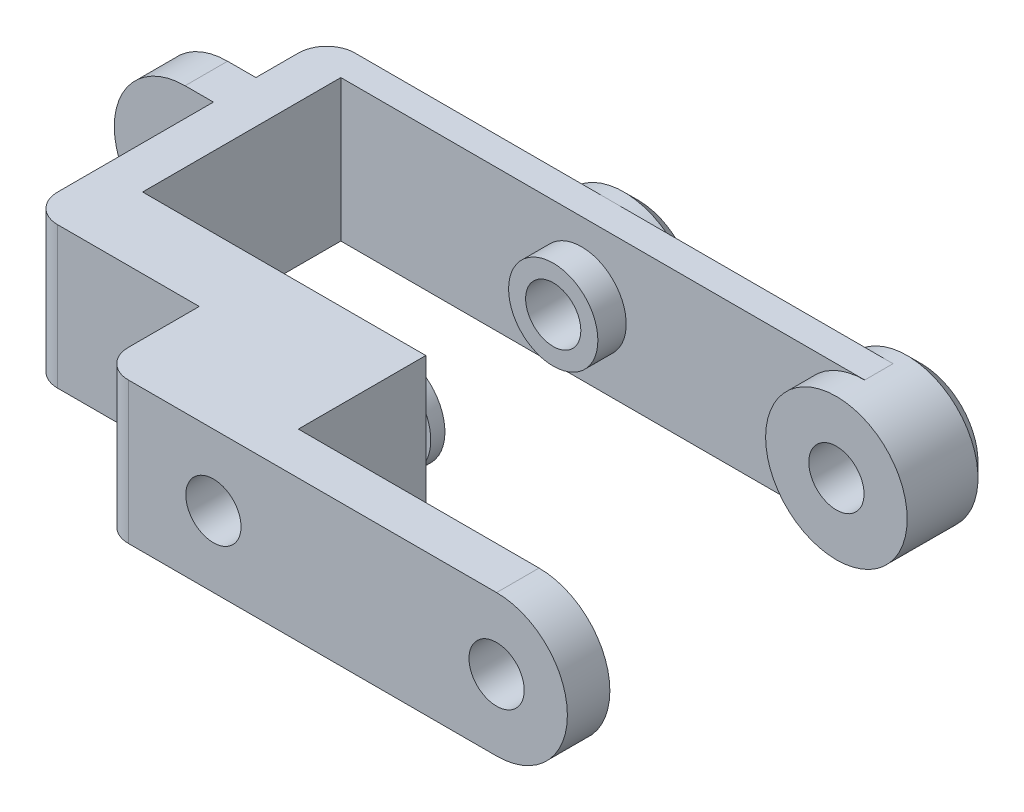
ISO-10303-21;
HEADER;
FILE_DESCRIPTION(('STEP AP214'),'2;1');
FILE_NAME('part.step','',(''),(''),'','','');
FILE_SCHEMA(('AUTOMOTIVE_DESIGN { 1 0 10303 214 1 1 1 1 }'));
ENDSEC;
DATA;
#1=APPLICATION_CONTEXT('core data for automotive mechanical design processes');
#2=APPLICATION_PROTOCOL_DEFINITION('international standard','automotive_design',2000,#1);
#3=PRODUCT_CONTEXT('',#1,'mechanical');
#4=PRODUCT('Part','Part','',(#3));
#5=PRODUCT_RELATED_PRODUCT_CATEGORY('part','',(#4));
#6=PRODUCT_DEFINITION_FORMATION('','',#4);
#7=PRODUCT_DEFINITION_CONTEXT('part definition',#1,'design');
#8=PRODUCT_DEFINITION('design','',#6,#7);
#9=PRODUCT_DEFINITION_SHAPE('','',#8);
#10=(LENGTH_UNIT() NAMED_UNIT(*) SI_UNIT(.MILLI.,.METRE.));
#11=(NAMED_UNIT(*) PLANE_ANGLE_UNIT() SI_UNIT($,.RADIAN.));
#12=(NAMED_UNIT(*) SI_UNIT($,.STERADIAN.) SOLID_ANGLE_UNIT());
#13=UNCERTAINTY_MEASURE_WITH_UNIT(LENGTH_MEASURE(1.E-05),#10,'distance_accuracy_value','');
#14=(GEOMETRIC_REPRESENTATION_CONTEXT(3) GLOBAL_UNCERTAINTY_ASSIGNED_CONTEXT((#13)) GLOBAL_UNIT_ASSIGNED_CONTEXT((#10,
#11,#12)) REPRESENTATION_CONTEXT('',''));
#15=CARTESIAN_POINT('',(0.,0.,0.));
#16=DIRECTION('',(0.,0.,1.));
#17=DIRECTION('',(1.,0.,0.));
#18=AXIS2_PLACEMENT_3D('',#15,#16,#17);
#19=CARTESIAN_POINT('',(-22.,0.,-14.));
#20=DIRECTION('',(0.,0.,1.));
#21=DIRECTION('',(1.,0.,0.));
#22=AXIS2_PLACEMENT_3D('',#19,#20,#21);
#23=PLANE('',#22);
#24=CARTESIAN_POINT('',(0.,0.,-14.));
#25=DIRECTION('',(0.,0.,-1.));
#26=DIRECTION('',(-1.,0.,0.));
#27=AXIS2_PLACEMENT_3D('',#24,#25,#26);
#28=CIRCLE('',#27,5.);
#29=CARTESIAN_POINT('',(0.,-5.,-14.));
#30=VERTEX_POINT('',#29);
#31=CARTESIAN_POINT('',(0.,5.,-14.));
#32=VERTEX_POINT('',#31);
#33=EDGE_CURVE('E206',#30,#32,#28,.T.);
#34=ORIENTED_EDGE('',*,*,#33,.F.);
#35=DIRECTION('',(1.,0.,0.));
#36=VECTOR('',#35,1.);
#37=CARTESIAN_POINT('',(-22.,-5.,-14.));
#38=LINE('',#37,#36);
#39=CARTESIAN_POINT('',(-18.,-5.,-14.));
#40=VERTEX_POINT('',#39);
#41=EDGE_CURVE('E187',#40,#30,#38,.T.);
#42=ORIENTED_EDGE('',*,*,#41,.F.);
#43=DIRECTION('',(0.,1.,0.));
#44=VECTOR('',#43,1.);
#45=CARTESIAN_POINT('',(-18.,0.,-14.));
#46=LINE('',#45,#44);
#47=CARTESIAN_POINT('',(-18.,5.,-14.));
#48=VERTEX_POINT('',#47);
#49=EDGE_CURVE('E390',#40,#48,#46,.T.);
#50=ORIENTED_EDGE('',*,*,#49,.T.);
#51=DIRECTION('',(-1.,0.,0.));
#52=VECTOR('',#51,1.);
#53=CARTESIAN_POINT('',(-22.,5.,-14.));
#54=LINE('',#53,#52);
#55=EDGE_CURVE('E199',#32,#48,#54,.T.);
#56=ORIENTED_EDGE('',*,*,#55,.F.);
#57=EDGE_LOOP('',(#34,#42,#50,#56));
#58=FACE_BOUND('',#57,.T.);
#59=ADVANCED_FACE('F41',(#58),#23,.F.);
#60=EDGE_CURVE('E57',#32,#30,#28,.T.);
#61=ORIENTED_EDGE('',*,*,#60,.F.);
#62=CARTESIAN_POINT('',(20.,5.,-14.));
#63=VERTEX_POINT('',#62);
#64=EDGE_CURVE('E327',#63,#32,#54,.T.);
#65=ORIENTED_EDGE('',*,*,#64,.F.);
#66=CARTESIAN_POINT('',(20.,0.,-14.));
#67=DIRECTION('',(0.,0.,-1.));
#68=DIRECTION('',(-1.,0.,0.));
#69=AXIS2_PLACEMENT_3D('',#66,#67,#68);
#70=CIRCLE('',#69,5.);
#71=CARTESIAN_POINT('',(20.,-5.,-14.));
#72=VERTEX_POINT('',#71);
#73=EDGE_CURVE('E202',#72,#63,#70,.T.);
#74=ORIENTED_EDGE('',*,*,#73,.F.);
#75=EDGE_CURVE('E190',#30,#72,#38,.T.);
#76=ORIENTED_EDGE('',*,*,#75,.F.);
#77=EDGE_LOOP('',(#61,#65,#74,#76));
#78=FACE_BOUND('',#77,.T.);
#79=ADVANCED_FACE('F201',(#78),#23,.F.);
#80=CARTESIAN_POINT('',(-17.,-5.,2.00000000000001));
#81=DIRECTION('',(0.,0.,1.));
#82=DIRECTION('',(1.,0.,0.));
#83=AXIS2_PLACEMENT_3D('',#80,#81,#82);
#84=PLANE('',#83);
#85=CARTESIAN_POINT('',(0.,0.,2.00000000000001));
#86=DIRECTION('',(0.,0.,1.));
#87=DIRECTION('',(1.,0.,0.));
#88=AXIS2_PLACEMENT_3D('',#85,#86,#87);
#89=CIRCLE('',#88,3.35);
#90=CARTESIAN_POINT('',(3.,-1.49080515158756,2.00000000000001));
#91=VERTEX_POINT('',#90);
#92=CARTESIAN_POINT('',(3.,1.49080515158756,2.00000000000001));
#93=VERTEX_POINT('',#92);
#94=EDGE_CURVE('E65',#91,#93,#89,.F.);
#95=ORIENTED_EDGE('',*,*,#94,.F.);
#96=DIRECTION('',(0.,1.,0.));
#97=VECTOR('',#96,1.);
#98=CARTESIAN_POINT('',(3.,-5.,2.00000000000001));
#99=LINE('',#98,#97);
#100=CARTESIAN_POINT('',(3.,-5.,2.00000000000001));
#101=VERTEX_POINT('',#100);
#102=EDGE_CURVE('E287',#101,#91,#99,.T.);
#103=ORIENTED_EDGE('',*,*,#102,.F.);
#104=DIRECTION('',(1.,0.,0.));
#105=VECTOR('',#104,1.);
#106=CARTESIAN_POINT('',(-17.,-5.,2.00000000000001));
#107=LINE('',#106,#105);
#108=CARTESIAN_POINT('',(-17.,-5.,2.00000000000001));
#109=VERTEX_POINT('',#108);
#110=EDGE_CURVE('E273',#109,#101,#107,.T.);
#111=ORIENTED_EDGE('',*,*,#110,.F.);
#112=DIRECTION('',(0.,1.,0.));
#113=VECTOR('',#112,1.);
#114=CARTESIAN_POINT('',(-17.,-5.,2.00000000000001));
#115=LINE('',#114,#113);
#116=CARTESIAN_POINT('',(-17.,5.,2.00000000000001));
#117=VERTEX_POINT('',#116);
#118=EDGE_CURVE('E291',#109,#117,#115,.T.);
#119=ORIENTED_EDGE('',*,*,#118,.T.);
#120=DIRECTION('',(-1.,0.,0.));
#121=VECTOR('',#120,1.);
#122=CARTESIAN_POINT('',(-22.,5.,2.00000000000001));
#123=LINE('',#122,#121);
#124=CARTESIAN_POINT('',(3.,5.,2.00000000000001));
#125=VERTEX_POINT('',#124);
#126=EDGE_CURVE('E316',#125,#117,#123,.T.);
#127=ORIENTED_EDGE('',*,*,#126,.F.);
#128=EDGE_CURVE('E290',#93,#125,#99,.T.);
#129=ORIENTED_EDGE('',*,*,#128,.F.);
#130=EDGE_LOOP('',(#95,#103,#111,#119,#127,#129));
#131=FACE_BOUND('',#130,.T.);
#132=ADVANCED_FACE('F422',(#131),#84,.F.);
#133=CARTESIAN_POINT('',(25.,-5.,-12.));
#134=DIRECTION('',(0.,0.,-1.));
#135=DIRECTION('',(-1.,0.,0.));
#136=AXIS2_PLACEMENT_3D('',#133,#134,#135);
#137=PLANE('',#136);
#138=CARTESIAN_POINT('',(20.,0.,-12.));
#139=DIRECTION('',(0.,0.,1.));
#140=DIRECTION('',(1.,0.,0.));
#141=AXIS2_PLACEMENT_3D('',#138,#139,#140);
#142=CIRCLE('',#141,5.);
#143=CARTESIAN_POINT('',(20.,5.,-12.));
#144=VERTEX_POINT('',#143);
#145=CARTESIAN_POINT('',(20.,-5.,-12.));
#146=VERTEX_POINT('',#145);
#147=EDGE_CURVE('E237',#144,#146,#142,.T.);
#148=ORIENTED_EDGE('',*,*,#147,.F.);
#149=DIRECTION('',(1.,0.,0.));
#150=VECTOR('',#149,1.);
#151=CARTESIAN_POINT('',(-22.,5.,-12.));
#152=LINE('',#151,#150);
#153=CARTESIAN_POINT('',(-17.,5.,-12.));
#154=VERTEX_POINT('',#153);
#155=EDGE_CURVE('E307',#154,#144,#152,.T.);
#156=ORIENTED_EDGE('',*,*,#155,.F.);
#157=DIRECTION('',(0.,1.,0.));
#158=VECTOR('',#157,1.);
#159=CARTESIAN_POINT('',(-17.,-5.,-12.));
#160=LINE('',#159,#158);
#161=CARTESIAN_POINT('',(-17.,-5.,-12.));
#162=VERTEX_POINT('',#161);
#163=EDGE_CURVE('E282',#162,#154,#160,.T.);
#164=ORIENTED_EDGE('',*,*,#163,.F.);
#165=DIRECTION('',(-1.,0.,0.));
#166=VECTOR('',#165,1.);
#167=CARTESIAN_POINT('',(25.,-5.,-12.));
#168=LINE('',#167,#166);
#169=EDGE_CURVE('E253',#146,#162,#168,.T.);
#170=ORIENTED_EDGE('',*,*,#169,.F.);
#171=EDGE_LOOP('',(#148,#156,#164,#170));
#172=FACE_BOUND('',#171,.T.);
#173=CARTESIAN_POINT('',(0.,0.,-12.));
#174=DIRECTION('',(0.,0.,-1.));
#175=DIRECTION('',(-1.,0.,0.));
#176=AXIS2_PLACEMENT_3D('',#173,#174,#175);
#177=CIRCLE('',#176,3.15295516941264);
#178=CARTESIAN_POINT('',(-3.15295516941264,0.,-12.));
#179=VERTEX_POINT('',#178);
#180=EDGE_CURVE('E394',#179,#179,#177,.F.);
#181=ORIENTED_EDGE('',*,*,#180,.F.);
#182=EDGE_LOOP('',(#181));
#183=FACE_BOUND('',#182,.T.);
#184=ADVANCED_FACE('F526',(#172,#183),#137,.F.);
#185=CARTESIAN_POINT('',(20.,0.,14.));
#186=DIRECTION('',(0.,0.,-1.));
#187=DIRECTION('',(-1.,0.,0.));
#188=AXIS2_PLACEMENT_3D('',#185,#186,#187);
#189=CYLINDRICAL_SURFACE('',#188,5.);
#190=CARTESIAN_POINT('',(20.,0.,11.));
#191=DIRECTION('',(0.,0.,1.));
#192=DIRECTION('',(1.,0.,0.));
#193=AXIS2_PLACEMENT_3D('',#190,#191,#192);
#194=CIRCLE('',#193,5.);
#195=CARTESIAN_POINT('',(20.,-5.,11.));
#196=VERTEX_POINT('',#195);
#197=CARTESIAN_POINT('',(20.,5.,11.));
#198=VERTEX_POINT('',#197);
#199=EDGE_CURVE('E314',#196,#198,#194,.T.);
#200=ORIENTED_EDGE('',*,*,#199,.T.);
#201=DIRECTION('',(0.,0.,-1.));
#202=VECTOR('',#201,1.);
#203=CARTESIAN_POINT('',(20.,5.,14.));
#204=LINE('',#203,#202);
#205=CARTESIAN_POINT('',(20.,5.,14.));
#206=VERTEX_POINT('',#205);
#207=EDGE_CURVE('E337',#206,#198,#204,.T.);
#208=ORIENTED_EDGE('',*,*,#207,.F.);
#209=CARTESIAN_POINT('',(20.,0.,14.));
#210=DIRECTION('',(0.,0.,1.));
#211=DIRECTION('',(1.,0.,0.));
#212=AXIS2_PLACEMENT_3D('',#209,#210,#211);
#213=CIRCLE('',#212,5.);
#214=CARTESIAN_POINT('',(20.,-5.,14.));
#215=VERTEX_POINT('',#214);
#216=EDGE_CURVE('E326',#215,#206,#213,.T.);
#217=ORIENTED_EDGE('',*,*,#216,.F.);
#218=DIRECTION('',(0.,0.,-1.));
#219=VECTOR('',#218,1.);
#220=CARTESIAN_POINT('',(20.,-5.,14.));
#221=LINE('',#220,#219);
#222=EDGE_CURVE('E341',#215,#196,#221,.T.);
#223=ORIENTED_EDGE('',*,*,#222,.T.);
#224=EDGE_LOOP('',(#200,#208,#217,#223));
#225=FACE_BOUND('',#224,.T.);
#226=ADVANCED_FACE('F436',(#225),#189,.T.);
#227=CARTESIAN_POINT('',(0.,0.,14.));
#228=DIRECTION('',(0.,0.,-1.));
#229=DIRECTION('',(-1.,0.,0.));
#230=AXIS2_PLACEMENT_3D('',#227,#228,#229);
#231=CYLINDRICAL_SURFACE('',#230,1.95);
#232=CARTESIAN_POINT('',(0.,0.,14.));
#233=DIRECTION('',(0.,0.,1.));
#234=DIRECTION('',(1.,0.,0.));
#235=AXIS2_PLACEMENT_3D('',#232,#233,#234);
#236=CIRCLE('',#235,1.95);
#237=CARTESIAN_POINT('',(1.95,0.,14.));
#238=VERTEX_POINT('',#237);
#239=EDGE_CURVE('E204',#238,#238,#236,.T.);
#240=ORIENTED_EDGE('',*,*,#239,.T.);
#241=EDGE_LOOP('',(#240));
#242=FACE_BOUND('',#241,.T.);
#243=CARTESIAN_POINT('',(0.,0.,1.00000000000001));
#244=DIRECTION('',(0.,0.,-1.));
#245=DIRECTION('',(-1.,0.,0.));
#246=AXIS2_PLACEMENT_3D('',#243,#244,#245);
#247=CIRCLE('',#246,1.95);
#248=CARTESIAN_POINT('',(-1.95,0.,1.00000000000001));
#249=VERTEX_POINT('',#248);
#250=EDGE_CURVE('E219',#249,#249,#247,.T.);
#251=ORIENTED_EDGE('',*,*,#250,.T.);
#252=EDGE_LOOP('',(#251));
#253=FACE_BOUND('',#252,.T.);
#254=ADVANCED_FACE('F592',(#242,#253),#231,.F.);
#255=CARTESIAN_POINT('',(20.,0.,14.));
#256=DIRECTION('',(0.,0.,-1.));
#257=DIRECTION('',(-1.,0.,0.));
#258=AXIS2_PLACEMENT_3D('',#255,#256,#257);
#259=CYLINDRICAL_SURFACE('',#258,1.95);
#260=CARTESIAN_POINT('',(20.,0.,11.));
#261=DIRECTION('',(0.,0.,1.));
#262=DIRECTION('',(1.,0.,0.));
#263=AXIS2_PLACEMENT_3D('',#260,#261,#262);
#264=CIRCLE('',#263,1.95);
#265=CARTESIAN_POINT('',(21.95,0.,11.));
#266=VERTEX_POINT('',#265);
#267=EDGE_CURVE('E310',#266,#266,#264,.T.);
#268=ORIENTED_EDGE('',*,*,#267,.F.);
#269=EDGE_LOOP('',(#268));
#270=FACE_BOUND('',#269,.T.);
#271=CARTESIAN_POINT('',(20.,0.,14.));
#272=DIRECTION('',(0.,0.,1.));
#273=DIRECTION('',(1.,0.,0.));
#274=AXIS2_PLACEMENT_3D('',#271,#272,#273);
#275=CIRCLE('',#274,1.95);
#276=CARTESIAN_POINT('',(21.95,0.,14.));
#277=VERTEX_POINT('',#276);
#278=EDGE_CURVE('E319',#277,#277,#275,.T.);
#279=ORIENTED_EDGE('',*,*,#278,.T.);
#280=EDGE_LOOP('',(#279));
#281=FACE_BOUND('',#280,.T.);
#282=ADVANCED_FACE('F589',(#270,#281),#259,.F.);
#283=CARTESIAN_POINT('',(-22.,0.,14.));
#284=DIRECTION('',(0.,0.,1.));
#285=DIRECTION('',(1.,0.,0.));
#286=AXIS2_PLACEMENT_3D('',#283,#284,#285);
#287=PLANE('',#286);
#288=DIRECTION('',(-1.,0.,0.));
#289=VECTOR('',#288,1.);
#290=CARTESIAN_POINT('',(-22.,5.,14.));
#291=LINE('',#290,#289);
#292=CARTESIAN_POINT('',(-6.,5.,14.));
#293=VERTEX_POINT('',#292);
#294=EDGE_CURVE('E329',#206,#293,#291,.T.);
#295=ORIENTED_EDGE('',*,*,#294,.T.);
#296=DIRECTION('',(0.,1.,0.));
#297=VECTOR('',#296,1.);
#298=CARTESIAN_POINT('',(-6.,-5.,14.));
#299=LINE('',#298,#297);
#300=CARTESIAN_POINT('',(-6.,-5.,14.));
#301=VERTEX_POINT('',#300);
#302=EDGE_CURVE('E378',#293,#301,#299,.F.);
#303=ORIENTED_EDGE('',*,*,#302,.T.);
#304=DIRECTION('',(1.,0.,0.));
#305=VECTOR('',#304,1.);
#306=CARTESIAN_POINT('',(-22.,-5.,14.));
#307=LINE('',#306,#305);
#308=EDGE_CURVE('E324',#301,#215,#307,.T.);
#309=ORIENTED_EDGE('',*,*,#308,.T.);
#310=ORIENTED_EDGE('',*,*,#216,.T.);
#311=EDGE_LOOP('',(#295,#303,#309,#310));
#312=FACE_BOUND('',#311,.T.);
#313=ORIENTED_EDGE('',*,*,#278,.F.);
#314=EDGE_LOOP('',(#313));
#315=FACE_BOUND('',#314,.T.);
#316=ORIENTED_EDGE('',*,*,#239,.F.);
#317=EDGE_LOOP('',(#316));
#318=FACE_BOUND('',#317,.T.);
#319=ADVANCED_FACE('F425',(#312,#315,#318),#287,.T.);
#320=CARTESIAN_POINT('',(-22.,0.,14.));
#321=DIRECTION('',(0.,0.,-1.));
#322=DIRECTION('',(-1.,0.,0.));
#323=AXIS2_PLACEMENT_3D('',#320,#321,#322);
#324=CYLINDRICAL_SURFACE('',#323,5.);
#325=CARTESIAN_POINT('',(-22.,0.,-6.));
#326=DIRECTION('',(0.,0.,-1.));
#327=DIRECTION('',(-1.,0.,0.));
#328=AXIS2_PLACEMENT_3D('',#325,#326,#327);
#329=CIRCLE('',#328,5.);
#330=CARTESIAN_POINT('',(-22.,-5.,-6.));
#331=VERTEX_POINT('',#330);
#332=CARTESIAN_POINT('',(-22.,5.,-6.));
#333=VERTEX_POINT('',#332);
#334=EDGE_CURVE('E305',#331,#333,#329,.T.);
#335=ORIENTED_EDGE('',*,*,#334,.T.);
#336=DIRECTION('',(0.,0.,-1.));
#337=VECTOR('',#336,1.);
#338=CARTESIAN_POINT('',(-22.,5.,14.));
#339=LINE('',#338,#337);
#340=CARTESIAN_POINT('',(-22.,5.,-9.));
#341=VERTEX_POINT('',#340);
#342=EDGE_CURVE('E331',#333,#341,#339,.T.);
#343=ORIENTED_EDGE('',*,*,#342,.T.);
#344=CARTESIAN_POINT('',(-22.,0.,-9.));
#345=DIRECTION('',(0.,0.,1.));
#346=DIRECTION('',(1.,0.,0.));
#347=AXIS2_PLACEMENT_3D('',#344,#345,#346);
#348=CIRCLE('',#347,5.);
#349=CARTESIAN_POINT('',(-22.,-5.,-9.));
#350=VERTEX_POINT('',#349);
#351=EDGE_CURVE('E299',#341,#350,#348,.T.);
#352=ORIENTED_EDGE('',*,*,#351,.T.);
#353=DIRECTION('',(0.,0.,-1.));
#354=VECTOR('',#353,1.);
#355=CARTESIAN_POINT('',(-22.,-5.,14.));
#356=LINE('',#355,#354);
#357=EDGE_CURVE('E344',#331,#350,#356,.T.);
#358=ORIENTED_EDGE('',*,*,#357,.F.);
#359=EDGE_LOOP('',(#335,#343,#352,#358));
#360=FACE_BOUND('',#359,.T.);
#361=ADVANCED_FACE('F439',(#360),#324,.T.);
#362=CARTESIAN_POINT('',(-22.,-5.,14.));
#363=DIRECTION('',(0.,1.,0.));
#364=DIRECTION('',(0.,0.,1.));
#365=AXIS2_PLACEMENT_3D('',#362,#363,#364);
#366=PLANE('',#365);
#367=ORIENTED_EDGE('',*,*,#308,.F.);
#368=CARTESIAN_POINT('',(-6.,-5.,12.));
#369=DIRECTION('',(0.,1.,0.));
#370=DIRECTION('',(0.,0.,1.));
#371=AXIS2_PLACEMENT_3D('',#368,#369,#370);
#372=CIRCLE('',#371,2.);
#373=CARTESIAN_POINT('',(-8.,-5.,12.));
#374=VERTEX_POINT('',#373);
#375=EDGE_CURVE('E383',#301,#374,#372,.F.);
#376=ORIENTED_EDGE('',*,*,#375,.T.);
#377=DIRECTION('',(0.,0.,-1.));
#378=VECTOR('',#377,1.);
#379=CARTESIAN_POINT('',(-8.,-5.,14.));
#380=LINE('',#379,#378);
#381=CARTESIAN_POINT('',(-8.,-5.,7.00000000000001));
#382=VERTEX_POINT('',#381);
#383=EDGE_CURVE('E248',#374,#382,#380,.T.);
#384=ORIENTED_EDGE('',*,*,#383,.T.);
#385=DIRECTION('',(-1.,0.,0.));
#386=VECTOR('',#385,1.);
#387=CARTESIAN_POINT('',(-20.,-5.,7.00000000000001));
#388=LINE('',#387,#386);
#389=CARTESIAN_POINT('',(-18.,-5.,7.00000000000001));
#390=VERTEX_POINT('',#389);
#391=EDGE_CURVE('E264',#382,#390,#388,.T.);
#392=ORIENTED_EDGE('',*,*,#391,.T.);
#393=CARTESIAN_POINT('',(-18.,-5.,5.00000000000001));
#394=DIRECTION('',(0.,1.,0.));
#395=DIRECTION('',(0.,0.,1.));
#396=AXIS2_PLACEMENT_3D('',#393,#394,#395);
#397=CIRCLE('',#396,2.);
#398=CARTESIAN_POINT('',(-20.,-5.,5.00000000000001));
#399=VERTEX_POINT('',#398);
#400=EDGE_CURVE('E381',#390,#399,#397,.F.);
#401=ORIENTED_EDGE('',*,*,#400,.T.);
#402=DIRECTION('',(0.,0.,-1.));
#403=VECTOR('',#402,1.);
#404=CARTESIAN_POINT('',(-20.,-5.,7.00000000000001));
#405=LINE('',#404,#403);
#406=CARTESIAN_POINT('',(-20.,-5.,-6.));
#407=VERTEX_POINT('',#406);
#408=EDGE_CURVE('E262',#399,#407,#405,.T.);
#409=ORIENTED_EDGE('',*,*,#408,.T.);
#410=DIRECTION('',(-1.,0.,0.));
#411=VECTOR('',#410,1.);
#412=CARTESIAN_POINT('',(-27.,-5.,-6.));
#413=LINE('',#412,#411);
#414=EDGE_CURVE('E257',#407,#331,#413,.T.);
#415=ORIENTED_EDGE('',*,*,#414,.T.);
#416=ORIENTED_EDGE('',*,*,#357,.T.);
#417=DIRECTION('',(1.,0.,0.));
#418=VECTOR('',#417,1.);
#419=CARTESIAN_POINT('',(-27.,-5.,-9.));
#420=LINE('',#419,#418);
#421=CARTESIAN_POINT('',(-20.,-5.,-9.));
#422=VERTEX_POINT('',#421);
#423=EDGE_CURVE('E250',#350,#422,#420,.T.);
#424=ORIENTED_EDGE('',*,*,#423,.T.);
#425=DIRECTION('',(0.,0.,-1.));
#426=VECTOR('',#425,1.);
#427=CARTESIAN_POINT('',(-20.,-5.,-14.));
#428=LINE('',#427,#426);
#429=CARTESIAN_POINT('',(-20.,-5.,-12.));
#430=VERTEX_POINT('',#429);
#431=EDGE_CURVE('E247',#422,#430,#428,.T.);
#432=ORIENTED_EDGE('',*,*,#431,.T.);
#433=CARTESIAN_POINT('',(-18.,-5.,-12.));
#434=DIRECTION('',(0.,1.,0.));
#435=DIRECTION('',(0.,0.,1.));
#436=AXIS2_PLACEMENT_3D('',#433,#434,#435);
#437=CIRCLE('',#436,2.);
#438=EDGE_CURVE('E194',#430,#40,#437,.F.);
#439=ORIENTED_EDGE('',*,*,#438,.T.);
#440=ORIENTED_EDGE('',*,*,#41,.T.);
#441=ORIENTED_EDGE('',*,*,#75,.T.);
#442=EDGE_CURVE('E340',#146,#72,#221,.T.);
#443=ORIENTED_EDGE('',*,*,#442,.F.);
#444=ORIENTED_EDGE('',*,*,#169,.T.);
#445=DIRECTION('',(0.,0.,1.));
#446=VECTOR('',#445,1.);
#447=CARTESIAN_POINT('',(-17.,-5.,-12.));
#448=LINE('',#447,#446);
#449=EDGE_CURVE('E270',#162,#109,#448,.T.);
#450=ORIENTED_EDGE('',*,*,#449,.T.);
#451=ORIENTED_EDGE('',*,*,#110,.T.);
#452=DIRECTION('',(0.,0.,1.));
#453=VECTOR('',#452,1.);
#454=CARTESIAN_POINT('',(3.,-5.,2.00000000000001));
#455=LINE('',#454,#453);
#456=CARTESIAN_POINT('',(3.,-5.,11.));
#457=VERTEX_POINT('',#456);
#458=EDGE_CURVE('E276',#101,#457,#455,.T.);
#459=ORIENTED_EDGE('',*,*,#458,.T.);
#460=DIRECTION('',(1.,0.,0.));
#461=VECTOR('',#460,1.);
#462=CARTESIAN_POINT('',(3.,-5.,11.));
#463=LINE('',#462,#461);
#464=EDGE_CURVE('E279',#457,#196,#463,.T.);
#465=ORIENTED_EDGE('',*,*,#464,.T.);
#466=ORIENTED_EDGE('',*,*,#222,.F.);
#467=EDGE_LOOP('',(#367,#376,#384,#392,#401,#409,#415,#416,#424,#432,#439,#440,#441,#443,#444,
#450,#451,#459,#465,#466));
#468=FACE_BOUND('',#467,.T.);
#469=ADVANCED_FACE('F189',(#468),#366,.F.);
#470=CARTESIAN_POINT('',(20.,0.,-15.));
#471=DIRECTION('',(0.,0.,-1.));
#472=DIRECTION('',(-1.,0.,0.));
#473=AXIS2_PLACEMENT_3D('',#470,#471,#472);
#474=CIRCLE('',#473,5.);
#475=CARTESIAN_POINT('',(15.,0.,-15.));
#476=VERTEX_POINT('',#475);
#477=EDGE_CURVE('E401',#476,#476,#474,.F.);
#478=ORIENTED_EDGE('',*,*,#477,.T.);
#479=EDGE_LOOP('',(#478));
#480=FACE_BOUND('',#479,.T.);
#481=EDGE_CURVE('E336',#144,#63,#204,.T.);
#482=ORIENTED_EDGE('',*,*,#481,.F.);
#483=ORIENTED_EDGE('',*,*,#147,.T.);
#484=ORIENTED_EDGE('',*,*,#442,.T.);
#485=ORIENTED_EDGE('',*,*,#73,.T.);
#486=EDGE_LOOP('',(#482,#483,#484,#485));
#487=FACE_BOUND('',#486,.T.);
#488=CARTESIAN_POINT('',(20.,0.,-10.));
#489=DIRECTION('',(0.,0.,1.));
#490=DIRECTION('',(1.,0.,0.));
#491=AXIS2_PLACEMENT_3D('',#488,#489,#490);
#492=CIRCLE('',#491,5.);
#493=CARTESIAN_POINT('',(25.,0.,-10.));
#494=VERTEX_POINT('',#493);
#495=EDGE_CURVE('E238',#494,#494,#492,.T.);
#496=ORIENTED_EDGE('',*,*,#495,.F.);
#497=EDGE_LOOP('',(#496));
#498=FACE_BOUND('',#497,.T.);
#499=ADVANCED_FACE('F431',(#480,#487,#498),#189,.T.);
#500=CARTESIAN_POINT('',(-22.,5.,14.));
#501=DIRECTION('',(0.,-1.,0.));
#502=DIRECTION('',(0.,0.,-1.));
#503=AXIS2_PLACEMENT_3D('',#500,#501,#502);
#504=PLANE('',#503);
#505=DIRECTION('',(0.,0.,1.));
#506=VECTOR('',#505,1.);
#507=CARTESIAN_POINT('',(-8.,5.,14.));
#508=LINE('',#507,#506);
#509=CARTESIAN_POINT('',(-8.,5.,7.00000000000001));
#510=VERTEX_POINT('',#509);
#511=CARTESIAN_POINT('',(-8.,5.,12.));
#512=VERTEX_POINT('',#511);
#513=EDGE_CURVE('E361',#510,#512,#508,.T.);
#514=ORIENTED_EDGE('',*,*,#513,.T.);
#515=CARTESIAN_POINT('',(-6.,5.,12.));
#516=DIRECTION('',(0.,-1.,0.));
#517=DIRECTION('',(0.,0.,-1.));
#518=AXIS2_PLACEMENT_3D('',#515,#516,#517);
#519=CIRCLE('',#518,2.);
#520=EDGE_CURVE('E376',#512,#293,#519,.F.);
#521=ORIENTED_EDGE('',*,*,#520,.T.);
#522=ORIENTED_EDGE('',*,*,#294,.F.);
#523=ORIENTED_EDGE('',*,*,#207,.T.);
#524=DIRECTION('',(-1.,0.,0.));
#525=VECTOR('',#524,1.);
#526=CARTESIAN_POINT('',(-22.,5.,11.));
#527=LINE('',#526,#525);
#528=CARTESIAN_POINT('',(3.,5.,11.));
#529=VERTEX_POINT('',#528);
#530=EDGE_CURVE('E311',#198,#529,#527,.T.);
#531=ORIENTED_EDGE('',*,*,#530,.T.);
#532=DIRECTION('',(0.,0.,-1.));
#533=VECTOR('',#532,1.);
#534=CARTESIAN_POINT('',(3.,5.,14.));
#535=LINE('',#534,#533);
#536=EDGE_CURVE('E356',#529,#125,#535,.T.);
#537=ORIENTED_EDGE('',*,*,#536,.T.);
#538=ORIENTED_EDGE('',*,*,#126,.T.);
#539=DIRECTION('',(0.,0.,-1.));
#540=VECTOR('',#539,1.);
#541=CARTESIAN_POINT('',(-17.,5.,14.));
#542=LINE('',#541,#540);
#543=EDGE_CURVE('E347',#117,#154,#542,.T.);
#544=ORIENTED_EDGE('',*,*,#543,.T.);
#545=ORIENTED_EDGE('',*,*,#155,.T.);
#546=ORIENTED_EDGE('',*,*,#481,.T.);
#547=ORIENTED_EDGE('',*,*,#64,.T.);
#548=ORIENTED_EDGE('',*,*,#55,.T.);
#549=CARTESIAN_POINT('',(-18.,5.,-12.));
#550=DIRECTION('',(0.,-1.,0.));
#551=DIRECTION('',(0.,0.,-1.));
#552=AXIS2_PLACEMENT_3D('',#549,#550,#551);
#553=CIRCLE('',#552,2.);
#554=CARTESIAN_POINT('',(-20.,5.,-12.));
#555=VERTEX_POINT('',#554);
#556=EDGE_CURVE('E372',#48,#555,#553,.F.);
#557=ORIENTED_EDGE('',*,*,#556,.T.);
#558=DIRECTION('',(0.,0.,1.));
#559=VECTOR('',#558,1.);
#560=CARTESIAN_POINT('',(-20.,5.,14.));
#561=LINE('',#560,#559);
#562=CARTESIAN_POINT('',(-20.,5.,-9.));
#563=VERTEX_POINT('',#562);
#564=EDGE_CURVE('E359',#555,#563,#561,.T.);
#565=ORIENTED_EDGE('',*,*,#564,.T.);
#566=DIRECTION('',(-1.,0.,0.));
#567=VECTOR('',#566,1.);
#568=CARTESIAN_POINT('',(-22.,5.,-9.));
#569=LINE('',#568,#567);
#570=EDGE_CURVE('E296',#563,#341,#569,.T.);
#571=ORIENTED_EDGE('',*,*,#570,.T.);
#572=ORIENTED_EDGE('',*,*,#342,.F.);
#573=DIRECTION('',(1.,0.,0.));
#574=VECTOR('',#573,1.);
#575=CARTESIAN_POINT('',(-22.,5.,-6.));
#576=LINE('',#575,#574);
#577=CARTESIAN_POINT('',(-20.,5.,-6.));
#578=VERTEX_POINT('',#577);
#579=EDGE_CURVE('E302',#333,#578,#576,.T.);
#580=ORIENTED_EDGE('',*,*,#579,.T.);
#581=DIRECTION('',(0.,0.,1.));
#582=VECTOR('',#581,1.);
#583=CARTESIAN_POINT('',(-20.,5.,14.));
#584=LINE('',#583,#582);
#585=CARTESIAN_POINT('',(-20.,5.,5.00000000000001));
#586=VERTEX_POINT('',#585);
#587=EDGE_CURVE('E366',#578,#586,#584,.T.);
#588=ORIENTED_EDGE('',*,*,#587,.T.);
#589=CARTESIAN_POINT('',(-18.,5.,5.00000000000001));
#590=DIRECTION('',(0.,-1.,0.));
#591=DIRECTION('',(0.,0.,-1.));
#592=AXIS2_PLACEMENT_3D('',#589,#590,#591);
#593=CIRCLE('',#592,2.);
#594=CARTESIAN_POINT('',(-18.,5.,7.00000000000001));
#595=VERTEX_POINT('',#594);
#596=EDGE_CURVE('E374',#586,#595,#593,.F.);
#597=ORIENTED_EDGE('',*,*,#596,.T.);
#598=DIRECTION('',(1.,0.,0.));
#599=VECTOR('',#598,1.);
#600=CARTESIAN_POINT('',(-22.,5.,7.00000000000001));
#601=LINE('',#600,#599);
#602=EDGE_CURVE('E364',#595,#510,#601,.T.);
#603=ORIENTED_EDGE('',*,*,#602,.T.);
#604=EDGE_LOOP('',(#514,#521,#522,#523,#531,#537,#538,#544,#545,#546,#547,#548,#557,#565,#571,
#572,#580,#588,#597,#603));
#605=FACE_BOUND('',#604,.T.);
#606=ADVANCED_FACE('F427',(#605),#504,.F.);
#607=CARTESIAN_POINT('',(0.,0.,-10.));
#608=DIRECTION('',(0.,0.,1.));
#609=DIRECTION('',(1.,0.,0.));
#610=AXIS2_PLACEMENT_3D('',#607,#608,#609);
#611=CIRCLE('',#610,1.95);
#612=CARTESIAN_POINT('',(1.95,0.,-10.));
#613=VERTEX_POINT('',#612);
#614=EDGE_CURVE('E231',#613,#613,#611,.T.);
#615=ORIENTED_EDGE('',*,*,#614,.T.);
#616=EDGE_LOOP('',(#615));
#617=FACE_BOUND('',#616,.T.);
#618=CARTESIAN_POINT('',(0.,0.,-16.));
#619=DIRECTION('',(0.,0.,-1.));
#620=DIRECTION('',(-1.,0.,0.));
#621=AXIS2_PLACEMENT_3D('',#618,#619,#620);
#622=CIRCLE('',#621,1.95);
#623=CARTESIAN_POINT('',(-1.95,0.,-16.));
#624=VERTEX_POINT('',#623);
#625=EDGE_CURVE('E211',#624,#624,#622,.T.);
#626=ORIENTED_EDGE('',*,*,#625,.T.);
#627=EDGE_LOOP('',(#626));
#628=FACE_BOUND('',#627,.T.);
#629=ADVANCED_FACE('F430',(#617,#628),#231,.F.);
#630=CARTESIAN_POINT('',(20.,0.,-10.));
#631=DIRECTION('',(0.,0.,1.));
#632=DIRECTION('',(1.,0.,0.));
#633=AXIS2_PLACEMENT_3D('',#630,#631,#632);
#634=CIRCLE('',#633,1.95);
#635=CARTESIAN_POINT('',(21.95,0.,-10.));
#636=VERTEX_POINT('',#635);
#637=EDGE_CURVE('E234',#636,#636,#634,.T.);
#638=ORIENTED_EDGE('',*,*,#637,.T.);
#639=EDGE_LOOP('',(#638));
#640=FACE_BOUND('',#639,.T.);
#641=CARTESIAN_POINT('',(20.,0.,-16.));
#642=DIRECTION('',(0.,0.,-1.));
#643=DIRECTION('',(-1.,0.,0.));
#644=AXIS2_PLACEMENT_3D('',#641,#642,#643);
#645=CIRCLE('',#644,1.95);
#646=CARTESIAN_POINT('',(18.05,0.,-16.));
#647=VERTEX_POINT('',#646);
#648=EDGE_CURVE('E213',#647,#647,#645,.T.);
#649=ORIENTED_EDGE('',*,*,#648,.T.);
#650=EDGE_LOOP('',(#649));
#651=FACE_BOUND('',#650,.T.);
#652=ADVANCED_FACE('F563',(#640,#651),#259,.F.);
#653=CARTESIAN_POINT('',(-20.,-5.,-14.));
#654=DIRECTION('',(1.,0.,0.));
#655=DIRECTION('',(0.,0.,-1.));
#656=AXIS2_PLACEMENT_3D('',#653,#654,#655);
#657=PLANE('',#656);
#658=ORIENTED_EDGE('',*,*,#564,.F.);
#659=DIRECTION('',(0.,1.,0.));
#660=VECTOR('',#659,1.);
#661=CARTESIAN_POINT('',(-20.,-5.,-12.));
#662=LINE('',#661,#660);
#663=EDGE_CURVE('E392',#555,#430,#662,.F.);
#664=ORIENTED_EDGE('',*,*,#663,.T.);
#665=ORIENTED_EDGE('',*,*,#431,.F.);
#666=DIRECTION('',(0.,1.,0.));
#667=VECTOR('',#666,1.);
#668=CARTESIAN_POINT('',(-20.,-5.,-9.));
#669=LINE('',#668,#667);
#670=EDGE_CURVE('E244',#422,#563,#669,.T.);
#671=ORIENTED_EDGE('',*,*,#670,.T.);
#672=EDGE_LOOP('',(#658,#664,#665,#671));
#673=FACE_BOUND('',#672,.T.);
#674=ADVANCED_FACE('F472',(#673),#657,.F.);
#675=CARTESIAN_POINT('',(-27.,-5.,-9.));
#676=DIRECTION('',(0.,0.,1.));
#677=DIRECTION('',(1.,0.,0.));
#678=AXIS2_PLACEMENT_3D('',#675,#676,#677);
#679=PLANE('',#678);
#680=CARTESIAN_POINT('',(-22.,0.,-9.));
#681=DIRECTION('',(0.,0.,1.));
#682=DIRECTION('',(1.,0.,0.));
#683=AXIS2_PLACEMENT_3D('',#680,#681,#682);
#684=CIRCLE('',#683,1.);
#685=CARTESIAN_POINT('',(-21.,0.,-9.));
#686=VERTEX_POINT('',#685);
#687=EDGE_CURVE('E286',#686,#686,#684,.T.);
#688=ORIENTED_EDGE('',*,*,#687,.T.);
#689=EDGE_LOOP('',(#688));
#690=FACE_BOUND('',#689,.T.);
#691=ORIENTED_EDGE('',*,*,#351,.F.);
#692=ORIENTED_EDGE('',*,*,#570,.F.);
#693=ORIENTED_EDGE('',*,*,#670,.F.);
#694=ORIENTED_EDGE('',*,*,#423,.F.);
#695=EDGE_LOOP('',(#691,#692,#693,#694));
#696=FACE_BOUND('',#695,.T.);
#697=ADVANCED_FACE('F476',(#690,#696),#679,.F.);
#698=CARTESIAN_POINT('',(-20.,-5.,7.00000000000001));
#699=DIRECTION('',(1.,0.,0.));
#700=DIRECTION('',(0.,0.,-1.));
#701=AXIS2_PLACEMENT_3D('',#698,#699,#700);
#702=PLANE('',#701);
#703=ORIENTED_EDGE('',*,*,#408,.F.);
#704=DIRECTION('',(0.,1.,0.));
#705=VECTOR('',#704,1.);
#706=CARTESIAN_POINT('',(-20.,-5.,5.00000000000001));
#707=LINE('',#706,#705);
#708=EDGE_CURVE('E385',#399,#586,#707,.T.);
#709=ORIENTED_EDGE('',*,*,#708,.T.);
#710=ORIENTED_EDGE('',*,*,#587,.F.);
#711=DIRECTION('',(0.,1.,0.));
#712=VECTOR('',#711,1.);
#713=CARTESIAN_POINT('',(-20.,-5.,-6.));
#714=LINE('',#713,#712);
#715=EDGE_CURVE('E241',#407,#578,#714,.T.);
#716=ORIENTED_EDGE('',*,*,#715,.F.);
#717=EDGE_LOOP('',(#703,#709,#710,#716));
#718=FACE_BOUND('',#717,.T.);
#719=ADVANCED_FACE('F487',(#718),#702,.F.);
#720=CARTESIAN_POINT('',(-20.,-5.,7.00000000000001));
#721=DIRECTION('',(0.,0.,-1.));
#722=DIRECTION('',(-1.,0.,0.));
#723=AXIS2_PLACEMENT_3D('',#720,#721,#722);
#724=PLANE('',#723);
#725=ORIENTED_EDGE('',*,*,#602,.F.);
#726=DIRECTION('',(0.,1.,0.));
#727=VECTOR('',#726,1.);
#728=CARTESIAN_POINT('',(-18.,-5.,7.00000000000001));
#729=LINE('',#728,#727);
#730=EDGE_CURVE('E388',#595,#390,#729,.F.);
#731=ORIENTED_EDGE('',*,*,#730,.T.);
#732=ORIENTED_EDGE('',*,*,#391,.F.);
#733=DIRECTION('',(0.,1.,0.));
#734=VECTOR('',#733,1.);
#735=CARTESIAN_POINT('',(-8.,-5.,7.00000000000001));
#736=LINE('',#735,#734);
#737=EDGE_CURVE('E254',#382,#510,#736,.T.);
#738=ORIENTED_EDGE('',*,*,#737,.T.);
#739=EDGE_LOOP('',(#725,#731,#732,#738));
#740=FACE_BOUND('',#739,.T.);
#741=ADVANCED_FACE('F493',(#740),#724,.F.);
#742=CARTESIAN_POINT('',(-8.,-5.,14.));
#743=DIRECTION('',(1.,0.,0.));
#744=DIRECTION('',(0.,0.,-1.));
#745=AXIS2_PLACEMENT_3D('',#742,#743,#744);
#746=PLANE('',#745);
#747=ORIENTED_EDGE('',*,*,#383,.F.);
#748=DIRECTION('',(0.,1.,0.));
#749=VECTOR('',#748,1.);
#750=CARTESIAN_POINT('',(-8.,5.,12.));
#751=LINE('',#750,#749);
#752=EDGE_CURVE('E369',#374,#512,#751,.T.);
#753=ORIENTED_EDGE('',*,*,#752,.T.);
#754=ORIENTED_EDGE('',*,*,#513,.F.);
#755=ORIENTED_EDGE('',*,*,#737,.F.);
#756=EDGE_LOOP('',(#747,#753,#754,#755));
#757=FACE_BOUND('',#756,.T.);
#758=ADVANCED_FACE('F500',(#757),#746,.F.);
#759=CARTESIAN_POINT('',(-27.,-5.,-6.));
#760=DIRECTION('',(0.,0.,-1.));
#761=DIRECTION('',(-1.,0.,0.));
#762=AXIS2_PLACEMENT_3D('',#759,#760,#761);
#763=PLANE('',#762);
#764=CARTESIAN_POINT('',(-22.,0.,-6.));
#765=DIRECTION('',(0.,0.,-1.));
#766=DIRECTION('',(-1.,0.,0.));
#767=AXIS2_PLACEMENT_3D('',#764,#765,#766);
#768=CIRCLE('',#767,1.);
#769=CARTESIAN_POINT('',(-23.,0.,-6.));
#770=VERTEX_POINT('',#769);
#771=EDGE_CURVE('E301',#770,#770,#768,.T.);
#772=ORIENTED_EDGE('',*,*,#771,.T.);
#773=EDGE_LOOP('',(#772));
#774=FACE_BOUND('',#773,.T.);
#775=ORIENTED_EDGE('',*,*,#414,.F.);
#776=ORIENTED_EDGE('',*,*,#715,.T.);
#777=ORIENTED_EDGE('',*,*,#579,.F.);
#778=ORIENTED_EDGE('',*,*,#334,.F.);
#779=EDGE_LOOP('',(#775,#776,#777,#778));
#780=FACE_BOUND('',#779,.T.);
#781=ADVANCED_FACE('F482',(#774,#780),#763,.F.);
#782=CARTESIAN_POINT('',(3.,-5.,2.00000000000001));
#783=DIRECTION('',(-1.,0.,0.));
#784=DIRECTION('',(0.,0.,1.));
#785=AXIS2_PLACEMENT_3D('',#782,#783,#784);
#786=PLANE('',#785);
#787=DIRECTION('',(0.,1.,0.));
#788=VECTOR('',#787,1.);
#789=CARTESIAN_POINT('',(3.,-5.,11.));
#790=LINE('',#789,#788);
#791=EDGE_CURVE('E283',#457,#529,#790,.T.);
#792=ORIENTED_EDGE('',*,*,#791,.F.);
#793=ORIENTED_EDGE('',*,*,#458,.F.);
#794=ORIENTED_EDGE('',*,*,#102,.T.);
#795=EDGE_CURVE('E289',#91,#93,#99,.T.);
#796=ORIENTED_EDGE('',*,*,#795,.T.);
#797=ORIENTED_EDGE('',*,*,#128,.T.);
#798=ORIENTED_EDGE('',*,*,#536,.F.);
#799=EDGE_LOOP('',(#792,#793,#794,#796,#797,#798));
#800=FACE_BOUND('',#799,.T.);
#801=ADVANCED_FACE('F515',(#800),#786,.F.);
#802=CARTESIAN_POINT('',(-17.,-5.,-12.));
#803=DIRECTION('',(-1.,0.,0.));
#804=DIRECTION('',(0.,0.,1.));
#805=AXIS2_PLACEMENT_3D('',#802,#803,#804);
#806=PLANE('',#805);
#807=ORIENTED_EDGE('',*,*,#118,.F.);
#808=ORIENTED_EDGE('',*,*,#449,.F.);
#809=ORIENTED_EDGE('',*,*,#163,.T.);
#810=ORIENTED_EDGE('',*,*,#543,.F.);
#811=EDGE_LOOP('',(#807,#808,#809,#810));
#812=FACE_BOUND('',#811,.T.);
#813=ADVANCED_FACE('F522',(#812),#806,.F.);
#814=CARTESIAN_POINT('',(3.,-5.,11.));
#815=DIRECTION('',(0.,0.,1.));
#816=DIRECTION('',(1.,0.,0.));
#817=AXIS2_PLACEMENT_3D('',#814,#815,#816);
#818=PLANE('',#817);
#819=ORIENTED_EDGE('',*,*,#267,.T.);
#820=EDGE_LOOP('',(#819));
#821=FACE_BOUND('',#820,.T.);
#822=ORIENTED_EDGE('',*,*,#464,.F.);
#823=ORIENTED_EDGE('',*,*,#791,.T.);
#824=ORIENTED_EDGE('',*,*,#530,.F.);
#825=ORIENTED_EDGE('',*,*,#199,.F.);
#826=EDGE_LOOP('',(#822,#823,#824,#825));
#827=FACE_BOUND('',#826,.T.);
#828=ADVANCED_FACE('F512',(#821,#827),#818,.F.);
#829=CARTESIAN_POINT('',(-22.,0.,14.));
#830=DIRECTION('',(0.,0.,-1.));
#831=DIRECTION('',(-1.,0.,0.));
#832=AXIS2_PLACEMENT_3D('',#829,#830,#831);
#833=CYLINDRICAL_SURFACE('',#832,1.);
#834=ORIENTED_EDGE('',*,*,#771,.F.);
#835=EDGE_LOOP('',(#834));
#836=FACE_BOUND('',#835,.T.);
#837=ORIENTED_EDGE('',*,*,#687,.F.);
#838=EDGE_LOOP('',(#837));
#839=FACE_BOUND('',#838,.T.);
#840=ADVANCED_FACE('F447',(#836,#839),#833,.F.);
#841=CARTESIAN_POINT('',(-6.,-5.,12.));
#842=DIRECTION('',(0.,-1.,0.));
#843=DIRECTION('',(0.,0.,-1.));
#844=AXIS2_PLACEMENT_3D('',#841,#842,#843);
#845=CYLINDRICAL_SURFACE('',#844,2.);
#846=ORIENTED_EDGE('',*,*,#375,.F.);
#847=ORIENTED_EDGE('',*,*,#302,.F.);
#848=ORIENTED_EDGE('',*,*,#520,.F.);
#849=ORIENTED_EDGE('',*,*,#752,.F.);
#850=EDGE_LOOP('',(#846,#847,#848,#849));
#851=FACE_BOUND('',#850,.T.);
#852=ADVANCED_FACE('F443',(#851),#845,.T.);
#853=CARTESIAN_POINT('',(-18.,-5.,5.00000000000001));
#854=DIRECTION('',(0.,1.,0.));
#855=DIRECTION('',(0.,0.,1.));
#856=AXIS2_PLACEMENT_3D('',#853,#854,#855);
#857=CYLINDRICAL_SURFACE('',#856,2.);
#858=ORIENTED_EDGE('',*,*,#400,.F.);
#859=ORIENTED_EDGE('',*,*,#730,.F.);
#860=ORIENTED_EDGE('',*,*,#596,.F.);
#861=ORIENTED_EDGE('',*,*,#708,.F.);
#862=EDGE_LOOP('',(#858,#859,#860,#861));
#863=FACE_BOUND('',#862,.T.);
#864=ADVANCED_FACE('F446',(#863),#857,.T.);
#865=CARTESIAN_POINT('',(-18.,0.,-12.));
#866=DIRECTION('',(0.,1.,0.));
#867=DIRECTION('',(0.,0.,1.));
#868=AXIS2_PLACEMENT_3D('',#865,#866,#867);
#869=CYLINDRICAL_SURFACE('',#868,2.);
#870=ORIENTED_EDGE('',*,*,#438,.F.);
#871=ORIENTED_EDGE('',*,*,#663,.F.);
#872=ORIENTED_EDGE('',*,*,#556,.F.);
#873=ORIENTED_EDGE('',*,*,#49,.F.);
#874=EDGE_LOOP('',(#870,#871,#872,#873));
#875=FACE_BOUND('',#874,.T.);
#876=ADVANCED_FACE('F451',(#875),#869,.T.);
#877=CARTESIAN_POINT('',(20.,0.,-10.));
#878=DIRECTION('',(0.,0.,1.));
#879=DIRECTION('',(1.,0.,0.));
#880=AXIS2_PLACEMENT_3D('',#877,#878,#879);
#881=PLANE('',#880);
#882=ORIENTED_EDGE('',*,*,#495,.T.);
#883=EDGE_LOOP('',(#882));
#884=FACE_BOUND('',#883,.T.);
#885=ORIENTED_EDGE('',*,*,#637,.F.);
#886=EDGE_LOOP('',(#885));
#887=FACE_BOUND('',#886,.T.);
#888=ADVANCED_FACE('F454',(#884,#887),#881,.T.);
#889=CARTESIAN_POINT('',(0.,0.,-10.));
#890=DIRECTION('',(0.,0.,1.));
#891=DIRECTION('',(1.,0.,0.));
#892=AXIS2_PLACEMENT_3D('',#889,#890,#891);
#893=PLANE('',#892);
#894=CARTESIAN_POINT('',(0.,0.,-10.));
#895=DIRECTION('',(0.,0.,1.));
#896=DIRECTION('',(1.,0.,0.));
#897=AXIS2_PLACEMENT_3D('',#894,#895,#896);
#898=CIRCLE('',#897,3.15295516941264);
#899=CARTESIAN_POINT('',(3.15295516941264,0.,-10.));
#900=VERTEX_POINT('',#899);
#901=EDGE_CURVE('E226',#900,#900,#898,.T.);
#902=ORIENTED_EDGE('',*,*,#901,.T.);
#903=EDGE_LOOP('',(#902));
#904=FACE_BOUND('',#903,.T.);
#905=ORIENTED_EDGE('',*,*,#614,.F.);
#906=EDGE_LOOP('',(#905));
#907=FACE_BOUND('',#906,.T.);
#908=ADVANCED_FACE('F464',(#904,#907),#893,.T.);
#909=CARTESIAN_POINT('',(0.,0.,-10.));
#910=DIRECTION('',(0.,0.,-1.));
#911=DIRECTION('',(-1.,0.,0.));
#912=AXIS2_PLACEMENT_3D('',#909,#910,#911);
#913=CYLINDRICAL_SURFACE('',#912,3.15295516941264);
#914=ORIENTED_EDGE('',*,*,#901,.F.);
#915=EDGE_LOOP('',(#914));
#916=FACE_BOUND('',#915,.T.);
#917=ORIENTED_EDGE('',*,*,#180,.T.);
#918=EDGE_LOOP('',(#917));
#919=FACE_BOUND('',#918,.T.);
#920=ADVANCED_FACE('F551',(#916,#919),#913,.T.);
#921=CARTESIAN_POINT('',(0.,0.,2.00000000000001));
#922=DIRECTION('',(0.,0.,-1.));
#923=DIRECTION('',(-1.,0.,0.));
#924=AXIS2_PLACEMENT_3D('',#921,#922,#923);
#925=PLANE('',#924);
#926=CARTESIAN_POINT('',(0.,0.,2.00000000000001));
#927=DIRECTION('',(0.,0.,-1.));
#928=DIRECTION('',(-1.,0.,0.));
#929=AXIS2_PLACEMENT_3D('',#926,#927,#928);
#930=CIRCLE('',#929,3.35);
#931=EDGE_CURVE('E222',#93,#91,#930,.T.);
#932=ORIENTED_EDGE('',*,*,#931,.F.);
#933=ORIENTED_EDGE('',*,*,#795,.F.);
#934=EDGE_LOOP('',(#932,#933));
#935=FACE_BOUND('',#934,.T.);
#936=ADVANCED_FACE('F532',(#935),#925,.F.);
#937=CARTESIAN_POINT('',(0.,0.,1.00000000000001));
#938=DIRECTION('',(0.,0.,-1.));
#939=DIRECTION('',(-1.,0.,0.));
#940=AXIS2_PLACEMENT_3D('',#937,#938,#939);
#941=PLANE('',#940);
#942=CARTESIAN_POINT('',(0.,0.,1.00000000000001));
#943=DIRECTION('',(0.,0.,-1.));
#944=DIRECTION('',(-1.,0.,0.));
#945=AXIS2_PLACEMENT_3D('',#942,#943,#944);
#946=CIRCLE('',#945,3.35);
#947=CARTESIAN_POINT('',(-3.35,0.,1.00000000000001));
#948=VERTEX_POINT('',#947);
#949=EDGE_CURVE('E223',#948,#948,#946,.T.);
#950=ORIENTED_EDGE('',*,*,#949,.T.);
#951=EDGE_LOOP('',(#950));
#952=FACE_BOUND('',#951,.T.);
#953=ORIENTED_EDGE('',*,*,#250,.F.);
#954=EDGE_LOOP('',(#953));
#955=FACE_BOUND('',#954,.T.);
#956=ADVANCED_FACE('F537',(#952,#955),#941,.T.);
#957=CARTESIAN_POINT('',(0.,0.,1.00000000000001));
#958=DIRECTION('',(0.,0.,1.));
#959=DIRECTION('',(1.,0.,0.));
#960=AXIS2_PLACEMENT_3D('',#957,#958,#959);
#961=CYLINDRICAL_SURFACE('',#960,3.35);
#962=ORIENTED_EDGE('',*,*,#949,.F.);
#963=EDGE_LOOP('',(#962));
#964=FACE_BOUND('',#963,.T.);
#965=ORIENTED_EDGE('',*,*,#931,.T.);
#966=ORIENTED_EDGE('',*,*,#94,.T.);
#967=EDGE_LOOP('',(#965,#966));
#968=FACE_BOUND('',#967,.T.);
#969=ADVANCED_FACE('F534',(#964,#968),#961,.T.);
#970=CARTESIAN_POINT('',(20.,0.,-16.));
#971=DIRECTION('',(0.,0.,-1.));
#972=DIRECTION('',(-1.,0.,0.));
#973=AXIS2_PLACEMENT_3D('',#970,#971,#972);
#974=PLANE('',#973);
#975=CARTESIAN_POINT('',(20.,0.,-16.));
#976=DIRECTION('',(0.,0.,-1.));
#977=DIRECTION('',(-1.,0.,0.));
#978=AXIS2_PLACEMENT_3D('',#975,#976,#977);
#979=CIRCLE('',#978,4.);
#980=CARTESIAN_POINT('',(16.,0.,-16.));
#981=VERTEX_POINT('',#980);
#982=EDGE_CURVE('E398',#981,#981,#979,.T.);
#983=ORIENTED_EDGE('',*,*,#982,.T.);
#984=EDGE_LOOP('',(#983));
#985=FACE_BOUND('',#984,.T.);
#986=ORIENTED_EDGE('',*,*,#648,.F.);
#987=EDGE_LOOP('',(#986));
#988=FACE_BOUND('',#987,.T.);
#989=ADVANCED_FACE('F536',(#985,#988),#974,.T.);
#990=CARTESIAN_POINT('',(0.,0.,-16.));
#991=DIRECTION('',(0.,0.,-1.));
#992=DIRECTION('',(-1.,0.,0.));
#993=AXIS2_PLACEMENT_3D('',#990,#991,#992);
#994=PLANE('',#993);
#995=CARTESIAN_POINT('',(0.,0.,-16.));
#996=DIRECTION('',(0.,0.,-1.));
#997=DIRECTION('',(-1.,0.,0.));
#998=AXIS2_PLACEMENT_3D('',#995,#996,#997);
#999=CIRCLE('',#998,4.);
#1000=CARTESIAN_POINT('',(-4.,0.,-16.));
#1001=VERTEX_POINT('',#1000);
#1002=EDGE_CURVE('E50',#1001,#1001,#999,.T.);
#1003=ORIENTED_EDGE('',*,*,#1002,.T.);
#1004=EDGE_LOOP('',(#1003));
#1005=FACE_BOUND('',#1004,.T.);
#1006=ORIENTED_EDGE('',*,*,#625,.F.);
#1007=EDGE_LOOP('',(#1006));
#1008=FACE_BOUND('',#1007,.T.);
#1009=ADVANCED_FACE('F406',(#1005,#1008),#994,.T.);
#1010=CARTESIAN_POINT('',(0.,0.,-16.));
#1011=DIRECTION('',(0.,0.,1.));
#1012=DIRECTION('',(1.,0.,0.));
#1013=AXIS2_PLACEMENT_3D('',#1010,#1011,#1012);
#1014=CYLINDRICAL_SURFACE('',#1013,5.);
#1015=CARTESIAN_POINT('',(0.,0.,-15.));
#1016=DIRECTION('',(0.,0.,-1.));
#1017=DIRECTION('',(-1.,0.,0.));
#1018=AXIS2_PLACEMENT_3D('',#1015,#1016,#1017);
#1019=CIRCLE('',#1018,5.);
#1020=CARTESIAN_POINT('',(-5.,0.,-15.));
#1021=VERTEX_POINT('',#1020);
#1022=EDGE_CURVE('E11',#1021,#1021,#1019,.F.);
#1023=ORIENTED_EDGE('',*,*,#1022,.T.);
#1024=EDGE_LOOP('',(#1023));
#1025=FACE_BOUND('',#1024,.T.);
#1026=ORIENTED_EDGE('',*,*,#60,.T.);
#1027=ORIENTED_EDGE('',*,*,#33,.T.);
#1028=EDGE_LOOP('',(#1026,#1027));
#1029=FACE_BOUND('',#1028,.T.);
#1030=ADVANCED_FACE('F210',(#1025,#1029),#1014,.T.);
#1031=CARTESIAN_POINT('',(20.,0.,-16.));
#1032=DIRECTION('',(0.,0.,1.));
#1033=DIRECTION('',(1.,0.,0.));
#1034=AXIS2_PLACEMENT_3D('',#1031,#1032,#1033);
#1035=CONICAL_SURFACE('',#1034,4.,0.785398163397445);
#1036=ORIENTED_EDGE('',*,*,#477,.F.);
#1037=EDGE_LOOP('',(#1036));
#1038=FACE_BOUND('',#1037,.T.);
#1039=ORIENTED_EDGE('',*,*,#982,.F.);
#1040=EDGE_LOOP('',(#1039));
#1041=FACE_BOUND('',#1040,.T.);
#1042=ADVANCED_FACE('F410',(#1038,#1041),#1035,.T.);
#1043=CARTESIAN_POINT('',(0.,0.,-16.));
#1044=DIRECTION('',(0.,0.,1.));
#1045=DIRECTION('',(1.,0.,0.));
#1046=AXIS2_PLACEMENT_3D('',#1043,#1044,#1045);
#1047=CONICAL_SURFACE('',#1046,4.,0.785398163397446);
#1048=ORIENTED_EDGE('',*,*,#1022,.F.);
#1049=EDGE_LOOP('',(#1048));
#1050=FACE_BOUND('',#1049,.T.);
#1051=ORIENTED_EDGE('',*,*,#1002,.F.);
#1052=EDGE_LOOP('',(#1051));
#1053=FACE_BOUND('',#1052,.T.);
#1054=ADVANCED_FACE('F44',(#1050,#1053),#1047,.T.);
#1055=CLOSED_SHELL('',(#59,#79,#132,#184,#226,#254,#282,#319,#361,#469,#499,#606,#629,#652,#674,
#697,#719,#741,#758,#781,#801,#813,#828,#840,#852,#864,#876,#888,#908,#920,#936,#956,#969,#989,
#1009,#1030,#1042,#1054));
#1056=MANIFOLD_SOLID_BREP('B2',#1055);
#1057=ADVANCED_BREP_SHAPE_REPRESENTATION('',(#18,#1056),#14);
#1058=SHAPE_DEFINITION_REPRESENTATION(#9,#1057);
ENDSEC;
END-ISO-10303-21;
